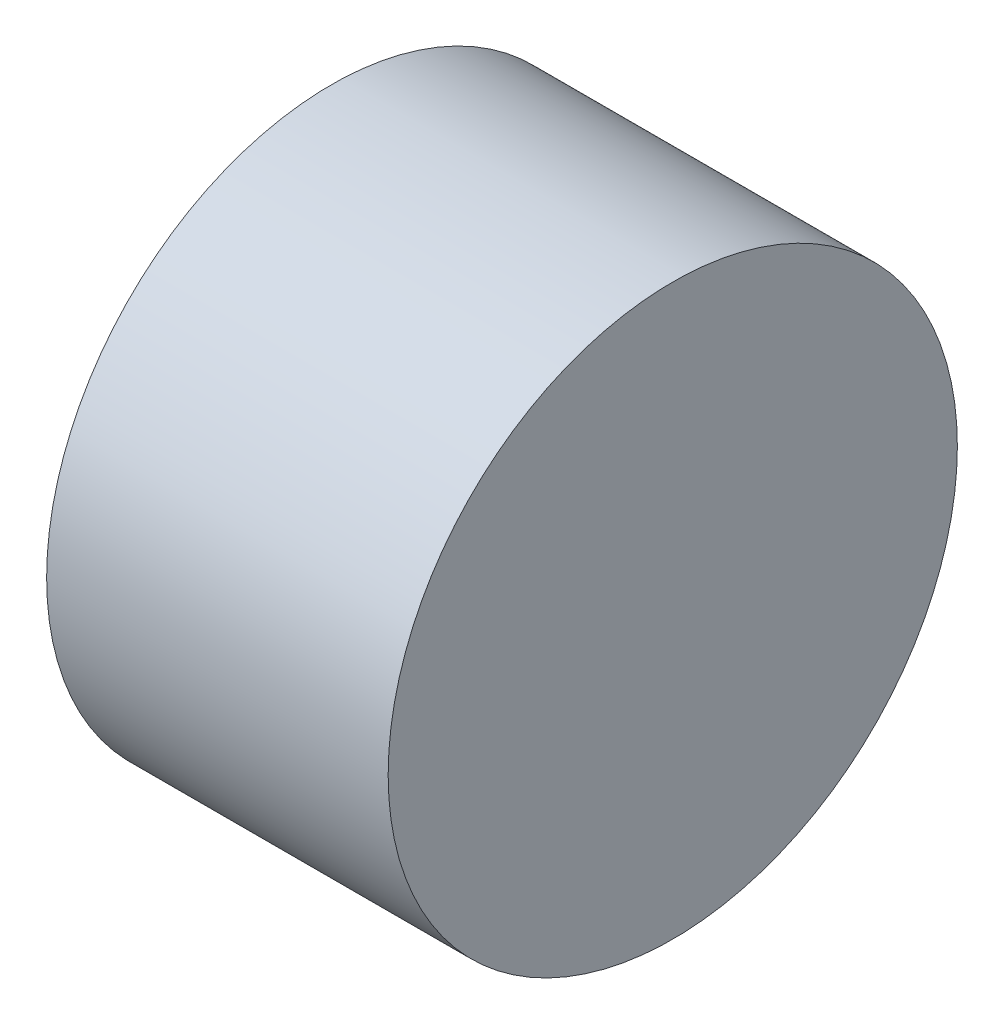
ISO-10303-21;
HEADER;
FILE_DESCRIPTION(('STEP AP214'),'2;1');
FILE_NAME('part.step','',(''),(''),'','','');
FILE_SCHEMA(('AUTOMOTIVE_DESIGN { 1 0 10303 214 1 1 1 1 }'));
ENDSEC;
DATA;
#1=APPLICATION_CONTEXT('core data for automotive mechanical design processes');
#2=APPLICATION_PROTOCOL_DEFINITION('international standard','automotive_design',2000,#1);
#3=PRODUCT_CONTEXT('',#1,'mechanical');
#4=PRODUCT('Part','Part','',(#3));
#5=PRODUCT_RELATED_PRODUCT_CATEGORY('part','',(#4));
#6=PRODUCT_DEFINITION_FORMATION('','',#4);
#7=PRODUCT_DEFINITION_CONTEXT('part definition',#1,'design');
#8=PRODUCT_DEFINITION('design','',#6,#7);
#9=PRODUCT_DEFINITION_SHAPE('','',#8);
#10=(LENGTH_UNIT() NAMED_UNIT(*) SI_UNIT(.MILLI.,.METRE.));
#11=(NAMED_UNIT(*) PLANE_ANGLE_UNIT() SI_UNIT($,.RADIAN.));
#12=(NAMED_UNIT(*) SI_UNIT($,.STERADIAN.) SOLID_ANGLE_UNIT());
#13=UNCERTAINTY_MEASURE_WITH_UNIT(LENGTH_MEASURE(1.E-05),#10,'distance_accuracy_value','');
#14=(GEOMETRIC_REPRESENTATION_CONTEXT(3) GLOBAL_UNCERTAINTY_ASSIGNED_CONTEXT((#13)) GLOBAL_UNIT_ASSIGNED_CONTEXT((#10,
#11,#12)) REPRESENTATION_CONTEXT('',''));
#15=CARTESIAN_POINT('',(0.,0.,0.));
#16=DIRECTION('',(0.,0.,1.));
#17=DIRECTION('',(1.,0.,0.));
#18=AXIS2_PLACEMENT_3D('',#15,#16,#17);
#19=CARTESIAN_POINT('',(-30.,0.,0.));
#20=DIRECTION('',(1.,0.,0.));
#21=DIRECTION('',(0.,0.,-1.));
#22=AXIS2_PLACEMENT_3D('',#19,#20,#21);
#23=CYLINDRICAL_SURFACE('',#22,50.);
#24=CARTESIAN_POINT('',(-30.,0.,0.));
#25=DIRECTION('',(1.,0.,0.));
#26=DIRECTION('',(0.,0.,-1.));
#27=AXIS2_PLACEMENT_3D('',#24,#25,#26);
#28=CIRCLE('',#27,50.);
#29=CARTESIAN_POINT('',(-30.,0.,-50.));
#30=VERTEX_POINT('',#29);
#31=EDGE_CURVE('E10',#30,#30,#28,.T.);
#32=ORIENTED_EDGE('',*,*,#31,.T.);
#33=EDGE_LOOP('',(#32));
#34=FACE_BOUND('',#33,.T.);
#35=CARTESIAN_POINT('',(30.,0.,0.));
#36=DIRECTION('',(1.,0.,0.));
#37=DIRECTION('',(0.,0.,-1.));
#38=AXIS2_PLACEMENT_3D('',#35,#36,#37);
#39=CIRCLE('',#38,50.);
#40=CARTESIAN_POINT('',(30.,0.,-50.));
#41=VERTEX_POINT('',#40);
#42=EDGE_CURVE('E42',#41,#41,#39,.T.);
#43=ORIENTED_EDGE('',*,*,#42,.F.);
#44=EDGE_LOOP('',(#43));
#45=FACE_BOUND('',#44,.T.);
#46=ADVANCED_FACE('F36',(#34,#45),#23,.T.);
#47=CARTESIAN_POINT('',(-30.,0.,0.));
#48=DIRECTION('',(1.,0.,0.));
#49=DIRECTION('',(0.,0.,-1.));
#50=AXIS2_PLACEMENT_3D('',#47,#48,#49);
#51=PLANE('',#50);
#52=ORIENTED_EDGE('',*,*,#31,.F.);
#53=EDGE_LOOP('',(#52));
#54=FACE_BOUND('',#53,.T.);
#55=ADVANCED_FACE('F51',(#54),#51,.F.);
#56=CARTESIAN_POINT('',(30.,0.,0.));
#57=DIRECTION('',(1.,0.,0.));
#58=DIRECTION('',(0.,0.,-1.));
#59=AXIS2_PLACEMENT_3D('',#56,#57,#58);
#60=PLANE('',#59);
#61=ORIENTED_EDGE('',*,*,#42,.T.);
#62=EDGE_LOOP('',(#61));
#63=FACE_BOUND('',#62,.T.);
#64=ADVANCED_FACE('F48',(#63),#60,.T.);
#65=CLOSED_SHELL('',(#46,#55,#64));
#66=MANIFOLD_SOLID_BREP('B2',#65);
#67=ADVANCED_BREP_SHAPE_REPRESENTATION('',(#18,#66),#14);
#68=SHAPE_DEFINITION_REPRESENTATION(#9,#67);
ENDSEC;
END-ISO-10303-21;
